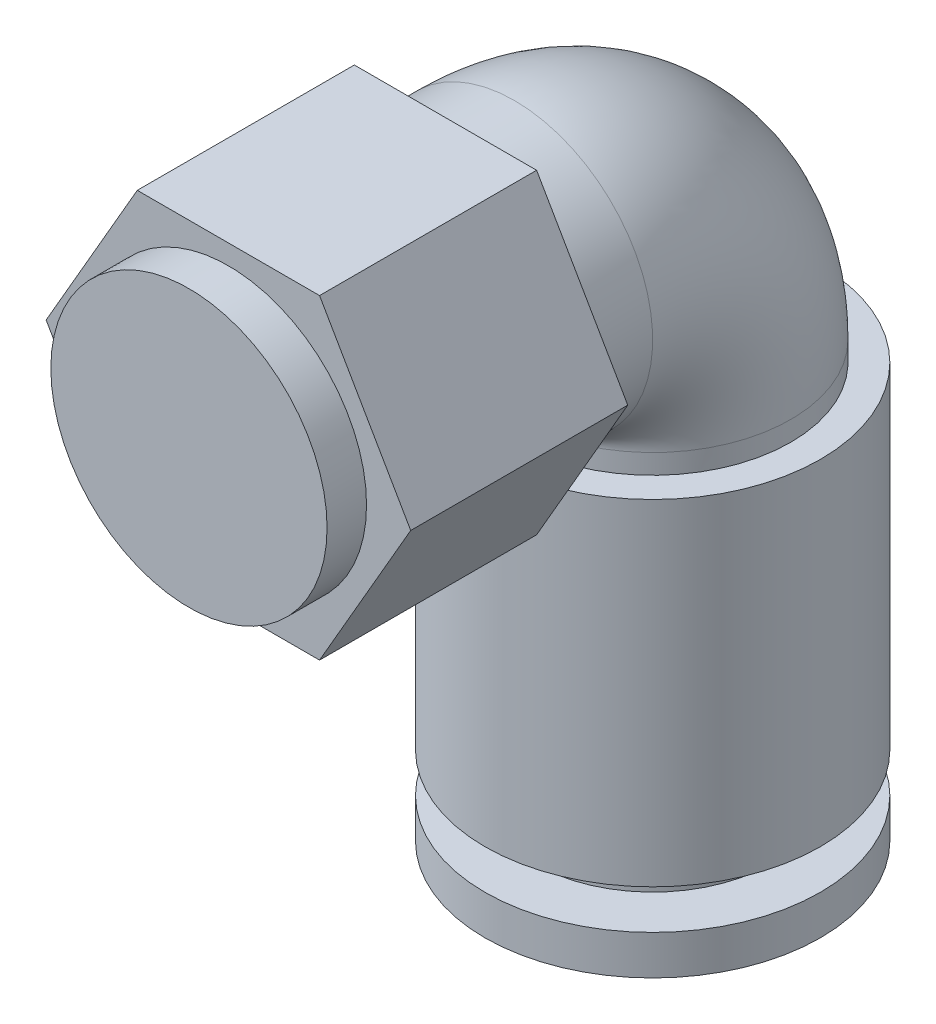
ISO-10303-21;
HEADER;
FILE_DESCRIPTION(('STEP AP214'),'2;1');
FILE_NAME('part.step','',(''),(''),'','','');
FILE_SCHEMA(('AUTOMOTIVE_DESIGN { 1 0 10303 214 1 1 1 1 }'));
ENDSEC;
DATA;
#1=APPLICATION_CONTEXT('core data for automotive mechanical design processes');
#2=APPLICATION_PROTOCOL_DEFINITION('international standard','automotive_design',2000,#1);
#3=PRODUCT_CONTEXT('',#1,'mechanical');
#4=PRODUCT('Part','Part','',(#3));
#5=PRODUCT_RELATED_PRODUCT_CATEGORY('part','',(#4));
#6=PRODUCT_DEFINITION_FORMATION('','',#4);
#7=PRODUCT_DEFINITION_CONTEXT('part definition',#1,'design');
#8=PRODUCT_DEFINITION('design','',#6,#7);
#9=PRODUCT_DEFINITION_SHAPE('','',#8);
#10=(LENGTH_UNIT() NAMED_UNIT(*) SI_UNIT(.MILLI.,.METRE.));
#11=(NAMED_UNIT(*) PLANE_ANGLE_UNIT() SI_UNIT($,.RADIAN.));
#12=(NAMED_UNIT(*) SI_UNIT($,.STERADIAN.) SOLID_ANGLE_UNIT());
#13=UNCERTAINTY_MEASURE_WITH_UNIT(LENGTH_MEASURE(1.E-05),#10,'distance_accuracy_value','');
#14=(GEOMETRIC_REPRESENTATION_CONTEXT(3) GLOBAL_UNCERTAINTY_ASSIGNED_CONTEXT((#13)) GLOBAL_UNIT_ASSIGNED_CONTEXT((#10,
#11,#12)) REPRESENTATION_CONTEXT('',''));
#15=CARTESIAN_POINT('',(0.,0.,0.));
#16=DIRECTION('',(0.,0.,1.));
#17=DIRECTION('',(1.,0.,0.));
#18=AXIS2_PLACEMENT_3D('',#15,#16,#17);
#19=CARTESIAN_POINT('',(2.3094010767585,4.,5.5));
#20=DIRECTION('',(0.,-1.,0.));
#21=DIRECTION('',(0.,0.,-1.));
#22=AXIS2_PLACEMENT_3D('',#19,#20,#21);
#23=PLANE('',#22);
#24=DIRECTION('',(-1.,0.,0.));
#25=VECTOR('',#24,1.);
#26=CARTESIAN_POINT('',(2.3094010767585,4.,0.));
#27=LINE('',#26,#25);
#28=CARTESIAN_POINT('',(2.3094010767585,4.,0.));
#29=VERTEX_POINT('',#28);
#30=CARTESIAN_POINT('',(-2.3094010767585,4.,0.));
#31=VERTEX_POINT('',#30);
#32=EDGE_CURVE('E128',#29,#31,#27,.T.);
#33=ORIENTED_EDGE('',*,*,#32,.T.);
#34=DIRECTION('',(0.,0.,-1.));
#35=VECTOR('',#34,1.);
#36=CARTESIAN_POINT('',(-2.3094010767585,4.,5.5));
#37=LINE('',#36,#35);
#38=CARTESIAN_POINT('',(-2.3094010767585,4.,5.5));
#39=VERTEX_POINT('',#38);
#40=EDGE_CURVE('E42',#39,#31,#37,.T.);
#41=ORIENTED_EDGE('',*,*,#40,.F.);
#42=DIRECTION('',(-1.,0.,0.));
#43=VECTOR('',#42,1.);
#44=CARTESIAN_POINT('',(2.3094010767585,4.,5.5));
#45=LINE('',#44,#43);
#46=CARTESIAN_POINT('',(2.3094010767585,4.,5.5));
#47=VERTEX_POINT('',#46);
#48=EDGE_CURVE('E139',#47,#39,#45,.T.);
#49=ORIENTED_EDGE('',*,*,#48,.F.);
#50=DIRECTION('',(0.,0.,-1.));
#51=VECTOR('',#50,1.);
#52=CARTESIAN_POINT('',(2.3094010767585,4.,5.5));
#53=LINE('',#52,#51);
#54=EDGE_CURVE('E124',#47,#29,#53,.T.);
#55=ORIENTED_EDGE('',*,*,#54,.T.);
#56=EDGE_LOOP('',(#33,#41,#49,#55));
#57=FACE_BOUND('',#56,.T.);
#58=ADVANCED_FACE('F39',(#57),#23,.F.);
#59=CARTESIAN_POINT('',(-2.3094010767585,4.,5.5));
#60=DIRECTION('',(0.866025403784439,-0.5,0.));
#61=DIRECTION('',(0.5,0.866025403784439,0.));
#62=AXIS2_PLACEMENT_3D('',#59,#60,#61);
#63=PLANE('',#62);
#64=DIRECTION('',(-0.5,-0.866025403784439,0.));
#65=VECTOR('',#64,1.);
#66=CARTESIAN_POINT('',(-2.3094010767585,4.,0.));
#67=LINE('',#66,#65);
#68=CARTESIAN_POINT('',(-4.61880215351701,0.,0.));
#69=VERTEX_POINT('',#68);
#70=EDGE_CURVE('E131',#31,#69,#67,.T.);
#71=ORIENTED_EDGE('',*,*,#70,.T.);
#72=DIRECTION('',(0.,0.,-1.));
#73=VECTOR('',#72,1.);
#74=CARTESIAN_POINT('',(-4.61880215351701,0.,5.5));
#75=LINE('',#74,#73);
#76=CARTESIAN_POINT('',(-4.61880215351701,0.,5.5));
#77=VERTEX_POINT('',#76);
#78=EDGE_CURVE('E142',#77,#69,#75,.T.);
#79=ORIENTED_EDGE('',*,*,#78,.F.);
#80=DIRECTION('',(-0.5,-0.866025403784439,0.));
#81=VECTOR('',#80,1.);
#82=CARTESIAN_POINT('',(-2.3094010767585,4.,5.5));
#83=LINE('',#82,#81);
#84=EDGE_CURVE('E96',#39,#77,#83,.T.);
#85=ORIENTED_EDGE('',*,*,#84,.F.);
#86=ORIENTED_EDGE('',*,*,#40,.T.);
#87=EDGE_LOOP('',(#71,#79,#85,#86));
#88=FACE_BOUND('',#87,.T.);
#89=ADVANCED_FACE('F155',(#88),#63,.F.);
#90=CARTESIAN_POINT('',(-4.61880215351701,0.,5.5));
#91=DIRECTION('',(0.866025403784439,0.5,0.));
#92=DIRECTION('',(-0.5,0.866025403784439,0.));
#93=AXIS2_PLACEMENT_3D('',#90,#91,#92);
#94=PLANE('',#93);
#95=DIRECTION('',(0.5,-0.866025403784438,0.));
#96=VECTOR('',#95,1.);
#97=CARTESIAN_POINT('',(-4.61880215351701,0.,0.));
#98=LINE('',#97,#96);
#99=CARTESIAN_POINT('',(-2.3094010767585,-4.,0.));
#100=VERTEX_POINT('',#99);
#101=EDGE_CURVE('E134',#69,#100,#98,.T.);
#102=ORIENTED_EDGE('',*,*,#101,.T.);
#103=DIRECTION('',(0.,0.,-1.));
#104=VECTOR('',#103,1.);
#105=CARTESIAN_POINT('',(-2.3094010767585,-4.,5.5));
#106=LINE('',#105,#104);
#107=CARTESIAN_POINT('',(-2.3094010767585,-4.,5.5));
#108=VERTEX_POINT('',#107);
#109=EDGE_CURVE('E119',#108,#100,#106,.T.);
#110=ORIENTED_EDGE('',*,*,#109,.F.);
#111=DIRECTION('',(0.5,-0.866025403784438,0.));
#112=VECTOR('',#111,1.);
#113=CARTESIAN_POINT('',(-4.61880215351701,0.,5.5));
#114=LINE('',#113,#112);
#115=EDGE_CURVE('E110',#77,#108,#114,.T.);
#116=ORIENTED_EDGE('',*,*,#115,.F.);
#117=ORIENTED_EDGE('',*,*,#78,.T.);
#118=EDGE_LOOP('',(#102,#110,#116,#117));
#119=FACE_BOUND('',#118,.T.);
#120=ADVANCED_FACE('F156',(#119),#94,.F.);
#121=CARTESIAN_POINT('',(-2.3094010767585,-4.,5.5));
#122=DIRECTION('',(0.,1.,0.));
#123=DIRECTION('',(-1.,0.,0.));
#124=AXIS2_PLACEMENT_3D('',#121,#122,#123);
#125=PLANE('',#124);
#126=DIRECTION('',(1.,0.,0.));
#127=VECTOR('',#126,1.);
#128=CARTESIAN_POINT('',(-2.3094010767585,-4.,0.));
#129=LINE('',#128,#127);
#130=CARTESIAN_POINT('',(2.3094010767585,-4.,0.));
#131=VERTEX_POINT('',#130);
#132=EDGE_CURVE('E118',#100,#131,#129,.T.);
#133=ORIENTED_EDGE('',*,*,#132,.T.);
#134=DIRECTION('',(0.,0.,-1.));
#135=VECTOR('',#134,1.);
#136=CARTESIAN_POINT('',(2.3094010767585,-4.,5.5));
#137=LINE('',#136,#135);
#138=CARTESIAN_POINT('',(2.3094010767585,-4.,5.5));
#139=VERTEX_POINT('',#138);
#140=EDGE_CURVE('E115',#139,#131,#137,.T.);
#141=ORIENTED_EDGE('',*,*,#140,.F.);
#142=DIRECTION('',(1.,0.,0.));
#143=VECTOR('',#142,1.);
#144=CARTESIAN_POINT('',(-2.3094010767585,-4.,5.5));
#145=LINE('',#144,#143);
#146=EDGE_CURVE('E104',#108,#139,#145,.T.);
#147=ORIENTED_EDGE('',*,*,#146,.F.);
#148=ORIENTED_EDGE('',*,*,#109,.T.);
#149=EDGE_LOOP('',(#133,#141,#147,#148));
#150=FACE_BOUND('',#149,.T.);
#151=ADVANCED_FACE('F116',(#150),#125,.F.);
#152=CARTESIAN_POINT('',(2.3094010767585,-4.,5.5));
#153=DIRECTION('',(-0.866025403784439,0.5,0.));
#154=DIRECTION('',(-0.5,-0.866025403784439,0.));
#155=AXIS2_PLACEMENT_3D('',#152,#153,#154);
#156=PLANE('',#155);
#157=DIRECTION('',(0.5,0.866025403784439,0.));
#158=VECTOR('',#157,1.);
#159=CARTESIAN_POINT('',(2.3094010767585,-4.,0.));
#160=LINE('',#159,#158);
#161=CARTESIAN_POINT('',(4.61880215351701,0.,0.));
#162=VERTEX_POINT('',#161);
#163=EDGE_CURVE('E81',#131,#162,#160,.T.);
#164=ORIENTED_EDGE('',*,*,#163,.T.);
#165=DIRECTION('',(0.,0.,-1.));
#166=VECTOR('',#165,1.);
#167=CARTESIAN_POINT('',(4.61880215351701,0.,5.5));
#168=LINE('',#167,#166);
#169=CARTESIAN_POINT('',(4.61880215351701,0.,5.5));
#170=VERTEX_POINT('',#169);
#171=EDGE_CURVE('E120',#170,#162,#168,.T.);
#172=ORIENTED_EDGE('',*,*,#171,.F.);
#173=DIRECTION('',(0.5,0.866025403784439,0.));
#174=VECTOR('',#173,1.);
#175=CARTESIAN_POINT('',(2.3094010767585,-4.,5.5));
#176=LINE('',#175,#174);
#177=EDGE_CURVE('E108',#139,#170,#176,.T.);
#178=ORIENTED_EDGE('',*,*,#177,.F.);
#179=ORIENTED_EDGE('',*,*,#140,.T.);
#180=EDGE_LOOP('',(#164,#172,#178,#179));
#181=FACE_BOUND('',#180,.T.);
#182=ADVANCED_FACE('F122',(#181),#156,.F.);
#183=CARTESIAN_POINT('',(4.61880215351701,0.,5.5));
#184=DIRECTION('',(-0.866025403784439,-0.5,0.));
#185=DIRECTION('',(0.5,-0.866025403784439,0.));
#186=AXIS2_PLACEMENT_3D('',#183,#184,#185);
#187=PLANE('',#186);
#188=DIRECTION('',(-0.5,0.866025403784438,0.));
#189=VECTOR('',#188,1.);
#190=CARTESIAN_POINT('',(4.61880215351701,0.,0.));
#191=LINE('',#190,#189);
#192=EDGE_CURVE('E87',#162,#29,#191,.T.);
#193=ORIENTED_EDGE('',*,*,#192,.T.);
#194=ORIENTED_EDGE('',*,*,#54,.F.);
#195=DIRECTION('',(-0.5,0.866025403784438,0.));
#196=VECTOR('',#195,1.);
#197=CARTESIAN_POINT('',(4.61880215351701,0.,5.5));
#198=LINE('',#197,#196);
#199=EDGE_CURVE('E57',#170,#47,#198,.T.);
#200=ORIENTED_EDGE('',*,*,#199,.F.);
#201=ORIENTED_EDGE('',*,*,#171,.T.);
#202=EDGE_LOOP('',(#193,#194,#200,#201));
#203=FACE_BOUND('',#202,.T.);
#204=ADVANCED_FACE('F161',(#203),#187,.F.);
#205=CARTESIAN_POINT('',(0.,0.,5.5));
#206=DIRECTION('',(0.,0.,1.));
#207=DIRECTION('',(1.,0.,0.));
#208=AXIS2_PLACEMENT_3D('',#205,#206,#207);
#209=PLANE('',#208);
#210=CARTESIAN_POINT('',(0.,0.,5.5));
#211=DIRECTION('',(0.,0.,1.));
#212=DIRECTION('',(1.,0.,0.));
#213=AXIS2_PLACEMENT_3D('',#210,#211,#212);
#214=CIRCLE('',#213,3.5);
#215=CARTESIAN_POINT('',(3.5,0.,5.5));
#216=VERTEX_POINT('',#215);
#217=EDGE_CURVE('E48',#216,#216,#214,.T.);
#218=ORIENTED_EDGE('',*,*,#217,.F.);
#219=EDGE_LOOP('',(#218));
#220=FACE_BOUND('',#219,.T.);
#221=ORIENTED_EDGE('',*,*,#48,.T.);
#222=ORIENTED_EDGE('',*,*,#84,.T.);
#223=ORIENTED_EDGE('',*,*,#115,.T.);
#224=ORIENTED_EDGE('',*,*,#146,.T.);
#225=ORIENTED_EDGE('',*,*,#177,.T.);
#226=ORIENTED_EDGE('',*,*,#199,.T.);
#227=EDGE_LOOP('',(#221,#222,#223,#224,#225,#226));
#228=FACE_BOUND('',#227,.T.);
#229=ADVANCED_FACE('F106',(#220,#228),#209,.T.);
#230=CARTESIAN_POINT('',(0.,0.,0.));
#231=DIRECTION('',(0.,0.,1.));
#232=DIRECTION('',(1.,0.,0.));
#233=AXIS2_PLACEMENT_3D('',#230,#231,#232);
#234=PLANE('',#233);
#235=CARTESIAN_POINT('',(0.,0.,0.));
#236=DIRECTION('',(0.,0.,-1.));
#237=DIRECTION('',(-1.,0.,0.));
#238=AXIS2_PLACEMENT_3D('',#235,#236,#237);
#239=CIRCLE('',#238,3.5);
#240=CARTESIAN_POINT('',(-3.5,0.,0.));
#241=VERTEX_POINT('',#240);
#242=EDGE_CURVE('E12',#241,#241,#239,.T.);
#243=ORIENTED_EDGE('',*,*,#242,.F.);
#244=EDGE_LOOP('',(#243));
#245=FACE_BOUND('',#244,.T.);
#246=ORIENTED_EDGE('',*,*,#32,.F.);
#247=ORIENTED_EDGE('',*,*,#192,.F.);
#248=ORIENTED_EDGE('',*,*,#163,.F.);
#249=ORIENTED_EDGE('',*,*,#132,.F.);
#250=ORIENTED_EDGE('',*,*,#101,.F.);
#251=ORIENTED_EDGE('',*,*,#70,.F.);
#252=EDGE_LOOP('',(#246,#247,#248,#249,#250,#251));
#253=FACE_BOUND('',#252,.T.);
#254=ADVANCED_FACE('F159',(#245,#253),#234,.F.);
#255=CARTESIAN_POINT('',(0.,0.,6.5));
#256=DIRECTION('',(0.,0.,-1.));
#257=DIRECTION('',(-1.,0.,0.));
#258=AXIS2_PLACEMENT_3D('',#255,#256,#257);
#259=CYLINDRICAL_SURFACE('',#258,3.5);
#260=CARTESIAN_POINT('',(0.,0.,6.5));
#261=DIRECTION('',(0.,0.,1.));
#262=DIRECTION('',(1.,0.,0.));
#263=AXIS2_PLACEMENT_3D('',#260,#261,#262);
#264=CIRCLE('',#263,3.5);
#265=CARTESIAN_POINT('',(3.5,0.,6.5));
#266=VERTEX_POINT('',#265);
#267=EDGE_CURVE('E132',#266,#266,#264,.T.);
#268=ORIENTED_EDGE('',*,*,#267,.F.);
#269=EDGE_LOOP('',(#268));
#270=FACE_BOUND('',#269,.T.);
#271=ORIENTED_EDGE('',*,*,#217,.T.);
#272=EDGE_LOOP('',(#271));
#273=FACE_BOUND('',#272,.T.);
#274=ADVANCED_FACE('F207',(#270,#273),#259,.T.);
#275=CARTESIAN_POINT('',(0.,0.,6.5));
#276=DIRECTION('',(0.,0.,1.));
#277=DIRECTION('',(1.,0.,0.));
#278=AXIS2_PLACEMENT_3D('',#275,#276,#277);
#279=PLANE('',#278);
#280=ORIENTED_EDGE('',*,*,#267,.T.);
#281=EDGE_LOOP('',(#280));
#282=FACE_BOUND('',#281,.T.);
#283=ADVANCED_FACE('F212',(#282),#279,.T.);
#284=CARTESIAN_POINT('',(0.,0.,-1.));
#285=DIRECTION('',(0.,0.,1.));
#286=DIRECTION('',(1.,0.,0.));
#287=AXIS2_PLACEMENT_3D('',#284,#285,#286);
#288=CYLINDRICAL_SURFACE('',#287,3.5);
#289=ORIENTED_EDGE('',*,*,#242,.T.);
#290=EDGE_LOOP('',(#289));
#291=FACE_BOUND('',#290,.T.);
#292=CARTESIAN_POINT('',(0.,0.,-1.75));
#293=DIRECTION('',(0.,0.,-1.));
#294=DIRECTION('',(-1.,0.,0.));
#295=AXIS2_PLACEMENT_3D('',#292,#293,#294);
#296=CIRCLE('',#295,3.5);
#297=CARTESIAN_POINT('',(0.,-3.5,-1.75));
#298=VERTEX_POINT('',#297);
#299=EDGE_CURVE('E374',#298,#298,#296,.T.);
#300=ORIENTED_EDGE('',*,*,#299,.F.);
#301=EDGE_LOOP('',(#300));
#302=FACE_BOUND('',#301,.T.);
#303=ADVANCED_FACE('F222',(#291,#302),#288,.T.);
#304=CARTESIAN_POINT('',(0.,-3.5,1.75));
#305=DIRECTION('',(0.,-1.,0.));
#306=DIRECTION('',(0.,0.,1.));
#307=AXIS2_PLACEMENT_3D('',#304,#305,#306);
#308=CIRCLE('',#307,3.5);
#309=TRIMMED_CURVE('',#308,(PARAMETER_VALUE(-3.14159263868863)),
(PARAMETER_VALUE(3.14159263868863)),.T.,.PARAMETER.);
#310=CARTESIAN_POINT('',(0.,-3.5,-1.75));
#311=DIRECTION('',(-1.,0.,0.));
#312=AXIS1_PLACEMENT('',#310,#311);
#313=SURFACE_OF_REVOLUTION('',#309,#312);
#314=CARTESIAN_POINT('',(0.,-3.5,-5.25));
#315=DIRECTION('',(0.,-1.,0.));
#316=DIRECTION('',(-1.,0.,0.));
#317=AXIS2_PLACEMENT_3D('',#314,#315,#316);
#318=CIRCLE('',#317,3.5);
#319=EDGE_CURVE('E382',#298,#298,#318,.T.);
#320=ORIENTED_EDGE('',*,*,#319,.F.);
#321=ORIENTED_EDGE('',*,*,#299,.T.);
#322=EDGE_LOOP('',(#320,#321));
#323=FACE_BOUND('',#322,.T.);
#324=ADVANCED_FACE('F239',(#323),#313,.T.);
#325=CARTESIAN_POINT('',(0.,-3.5,-5.25));
#326=DIRECTION('',(0.,-1.,0.));
#327=DIRECTION('',(0.,0.,-1.));
#328=AXIS2_PLACEMENT_3D('',#325,#326,#327);
#329=CYLINDRICAL_SURFACE('',#328,3.5);
#330=CARTESIAN_POINT('',(0.,-4.,-5.25));
#331=DIRECTION('',(0.,-1.,0.));
#332=DIRECTION('',(-1.,0.,0.));
#333=AXIS2_PLACEMENT_3D('',#330,#331,#332);
#334=CIRCLE('',#333,3.5);
#335=CARTESIAN_POINT('',(-3.5,-4.,-5.25));
#336=VERTEX_POINT('',#335);
#337=EDGE_CURVE('E385',#336,#336,#334,.T.);
#338=ORIENTED_EDGE('',*,*,#337,.F.);
#339=EDGE_LOOP('',(#338));
#340=FACE_BOUND('',#339,.T.);
#341=ORIENTED_EDGE('',*,*,#319,.T.);
#342=EDGE_LOOP('',(#341));
#343=FACE_BOUND('',#342,.T.);
#344=ADVANCED_FACE('F242',(#340,#343),#329,.T.);
#345=CARTESIAN_POINT('',(0.,-12.5,-5.25));
#346=DIRECTION('',(0.,1.,0.));
#347=DIRECTION('',(-1.,0.,0.));
#348=AXIS2_PLACEMENT_3D('',#345,#346,#347);
#349=CYLINDRICAL_SURFACE('',#348,4.25);
#350=CARTESIAN_POINT('',(0.,-12.5,-5.25));
#351=DIRECTION('',(0.,-1.,0.));
#352=DIRECTION('',(1.,0.,0.));
#353=AXIS2_PLACEMENT_3D('',#350,#351,#352);
#354=CIRCLE('',#353,4.25);
#355=CARTESIAN_POINT('',(4.25,-12.5,-5.25));
#356=VERTEX_POINT('',#355);
#357=EDGE_CURVE('E375',#356,#356,#354,.T.);
#358=ORIENTED_EDGE('',*,*,#357,.F.);
#359=EDGE_LOOP('',(#358));
#360=FACE_BOUND('',#359,.T.);
#361=CARTESIAN_POINT('',(0.,-4.,-5.25));
#362=DIRECTION('',(0.,-1.,0.));
#363=DIRECTION('',(1.,0.,0.));
#364=AXIS2_PLACEMENT_3D('',#361,#362,#363);
#365=CIRCLE('',#364,4.25);
#366=CARTESIAN_POINT('',(4.25,-4.,-5.25));
#367=VERTEX_POINT('',#366);
#368=EDGE_CURVE('E370',#367,#367,#365,.T.);
#369=ORIENTED_EDGE('',*,*,#368,.T.);
#370=EDGE_LOOP('',(#369));
#371=FACE_BOUND('',#370,.T.);
#372=ADVANCED_FACE('F253',(#360,#371),#349,.T.);
#373=CARTESIAN_POINT('',(0.,-12.5,-5.25));
#374=DIRECTION('',(0.,-1.,0.));
#375=DIRECTION('',(1.,0.,0.));
#376=AXIS2_PLACEMENT_3D('',#373,#374,#375);
#377=PLANE('',#376);
#378=CARTESIAN_POINT('',(0.,-12.5,-5.25));
#379=DIRECTION('',(0.,-1.,0.));
#380=DIRECTION('',(1.,0.,0.));
#381=AXIS2_PLACEMENT_3D('',#378,#379,#380);
#382=CIRCLE('',#381,3.);
#383=CARTESIAN_POINT('',(3.,-12.5,-5.25));
#384=VERTEX_POINT('',#383);
#385=EDGE_CURVE('E371',#384,#384,#382,.T.);
#386=ORIENTED_EDGE('',*,*,#385,.F.);
#387=EDGE_LOOP('',(#386));
#388=FACE_BOUND('',#387,.T.);
#389=ORIENTED_EDGE('',*,*,#357,.T.);
#390=EDGE_LOOP('',(#389));
#391=FACE_BOUND('',#390,.T.);
#392=ADVANCED_FACE('F271',(#388,#391),#377,.T.);
#393=CARTESIAN_POINT('',(0.,-4.,-5.25));
#394=DIRECTION('',(0.,-1.,0.));
#395=DIRECTION('',(1.,0.,0.));
#396=AXIS2_PLACEMENT_3D('',#393,#394,#395);
#397=PLANE('',#396);
#398=ORIENTED_EDGE('',*,*,#337,.T.);
#399=EDGE_LOOP('',(#398));
#400=FACE_BOUND('',#399,.T.);
#401=ORIENTED_EDGE('',*,*,#368,.F.);
#402=EDGE_LOOP('',(#401));
#403=FACE_BOUND('',#402,.T.);
#404=ADVANCED_FACE('F281',(#400,#403),#397,.F.);
#405=CARTESIAN_POINT('',(0.,-13.5,-5.25));
#406=DIRECTION('',(0.,1.,0.));
#407=DIRECTION('',(-1.,0.,0.));
#408=AXIS2_PLACEMENT_3D('',#405,#406,#407);
#409=CYLINDRICAL_SURFACE('',#408,3.);
#410=CARTESIAN_POINT('',(0.,-13.5,-5.25));
#411=DIRECTION('',(0.,-1.,0.));
#412=DIRECTION('',(1.,0.,0.));
#413=AXIS2_PLACEMENT_3D('',#410,#411,#412);
#414=CIRCLE('',#413,3.);
#415=CARTESIAN_POINT('',(3.,-13.5,-5.25));
#416=VERTEX_POINT('',#415);
#417=EDGE_CURVE('E366',#416,#416,#414,.T.);
#418=ORIENTED_EDGE('',*,*,#417,.F.);
#419=EDGE_LOOP('',(#418));
#420=FACE_BOUND('',#419,.T.);
#421=ORIENTED_EDGE('',*,*,#385,.T.);
#422=EDGE_LOOP('',(#421));
#423=FACE_BOUND('',#422,.T.);
#424=ADVANCED_FACE('F291',(#420,#423),#409,.T.);
#425=CARTESIAN_POINT('',(0.,-14.5,-5.25));
#426=DIRECTION('',(0.,1.,0.));
#427=DIRECTION('',(-1.,0.,0.));
#428=AXIS2_PLACEMENT_3D('',#425,#426,#427);
#429=CYLINDRICAL_SURFACE('',#428,4.25);
#430=CARTESIAN_POINT('',(0.,-14.5,-5.25));
#431=DIRECTION('',(0.,-1.,0.));
#432=DIRECTION('',(1.,0.,0.));
#433=AXIS2_PLACEMENT_3D('',#430,#431,#432);
#434=CIRCLE('',#433,4.25);
#435=CARTESIAN_POINT('',(4.25,-14.5,-5.25));
#436=VERTEX_POINT('',#435);
#437=EDGE_CURVE('E360',#436,#436,#434,.T.);
#438=ORIENTED_EDGE('',*,*,#437,.F.);
#439=EDGE_LOOP('',(#438));
#440=FACE_BOUND('',#439,.T.);
#441=CARTESIAN_POINT('',(0.,-13.5,-5.25));
#442=DIRECTION('',(0.,-1.,0.));
#443=DIRECTION('',(1.,0.,0.));
#444=AXIS2_PLACEMENT_3D('',#441,#442,#443);
#445=CIRCLE('',#444,4.25);
#446=CARTESIAN_POINT('',(4.25,-13.5,-5.25));
#447=VERTEX_POINT('',#446);
#448=EDGE_CURVE('E356',#447,#447,#445,.T.);
#449=ORIENTED_EDGE('',*,*,#448,.T.);
#450=EDGE_LOOP('',(#449));
#451=FACE_BOUND('',#450,.T.);
#452=ADVANCED_FACE('F301',(#440,#451),#429,.T.);
#453=CARTESIAN_POINT('',(0.,-14.5,-5.25));
#454=DIRECTION('',(0.,-1.,0.));
#455=DIRECTION('',(1.,0.,0.));
#456=AXIS2_PLACEMENT_3D('',#453,#454,#455);
#457=PLANE('',#456);
#458=CARTESIAN_POINT('',(0.,-14.5,-5.25));
#459=DIRECTION('',(0.,-1.,0.));
#460=DIRECTION('',(1.,0.,0.));
#461=AXIS2_PLACEMENT_3D('',#458,#459,#460);
#462=CIRCLE('',#461,2.5);
#463=CARTESIAN_POINT('',(2.5,-14.5,-5.25));
#464=VERTEX_POINT('',#463);
#465=EDGE_CURVE('E357',#464,#464,#462,.T.);
#466=ORIENTED_EDGE('',*,*,#465,.F.);
#467=EDGE_LOOP('',(#466));
#468=FACE_BOUND('',#467,.T.);
#469=ORIENTED_EDGE('',*,*,#437,.T.);
#470=EDGE_LOOP('',(#469));
#471=FACE_BOUND('',#470,.T.);
#472=ADVANCED_FACE('F311',(#468,#471),#457,.T.);
#473=CARTESIAN_POINT('',(0.,-13.5,-5.25));
#474=DIRECTION('',(0.,-1.,0.));
#475=DIRECTION('',(1.,0.,0.));
#476=AXIS2_PLACEMENT_3D('',#473,#474,#475);
#477=PLANE('',#476);
#478=ORIENTED_EDGE('',*,*,#417,.T.);
#479=EDGE_LOOP('',(#478));
#480=FACE_BOUND('',#479,.T.);
#481=ORIENTED_EDGE('',*,*,#448,.F.);
#482=EDGE_LOOP('',(#481));
#483=FACE_BOUND('',#482,.T.);
#484=ADVANCED_FACE('F319',(#480,#483),#477,.F.);
#485=CARTESIAN_POINT('',(0.,-9.5,-5.25));
#486=DIRECTION('',(0.,-1.,0.));
#487=DIRECTION('',(1.,0.,0.));
#488=AXIS2_PLACEMENT_3D('',#485,#486,#487);
#489=CYLINDRICAL_SURFACE('',#488,2.5);
#490=CARTESIAN_POINT('',(0.,-9.5,-5.25));
#491=DIRECTION('',(0.,-1.,0.));
#492=DIRECTION('',(1.,0.,0.));
#493=AXIS2_PLACEMENT_3D('',#490,#491,#492);
#494=CIRCLE('',#493,2.5);
#495=CARTESIAN_POINT('',(2.5,-9.5,-5.25));
#496=VERTEX_POINT('',#495);
#497=EDGE_CURVE('E355',#496,#496,#494,.T.);
#498=ORIENTED_EDGE('',*,*,#497,.F.);
#499=EDGE_LOOP('',(#498));
#500=FACE_BOUND('',#499,.T.);
#501=ORIENTED_EDGE('',*,*,#465,.T.);
#502=EDGE_LOOP('',(#501));
#503=FACE_BOUND('',#502,.T.);
#504=ADVANCED_FACE('F323',(#500,#503),#489,.F.);
#505=CARTESIAN_POINT('',(0.,-9.5,-5.25));
#506=DIRECTION('',(0.,-1.,0.));
#507=DIRECTION('',(1.,0.,0.));
#508=AXIS2_PLACEMENT_3D('',#505,#506,#507);
#509=PLANE('',#508);
#510=ORIENTED_EDGE('',*,*,#497,.T.);
#511=EDGE_LOOP('',(#510));
#512=FACE_BOUND('',#511,.T.);
#513=ADVANCED_FACE('F339',(#512),#509,.T.);
#514=CLOSED_SHELL('',(#58,#89,#120,#151,#182,#204,#229,#254,#274,#283,#303,#324,#344,#372,#392,
#404,#424,#452,#472,#484,#504,#513));
#515=MANIFOLD_SOLID_BREP('B2',#514);
#516=ADVANCED_BREP_SHAPE_REPRESENTATION('',(#18,#515),#14);
#517=SHAPE_DEFINITION_REPRESENTATION(#9,#516);
ENDSEC;
END-ISO-10303-21;
